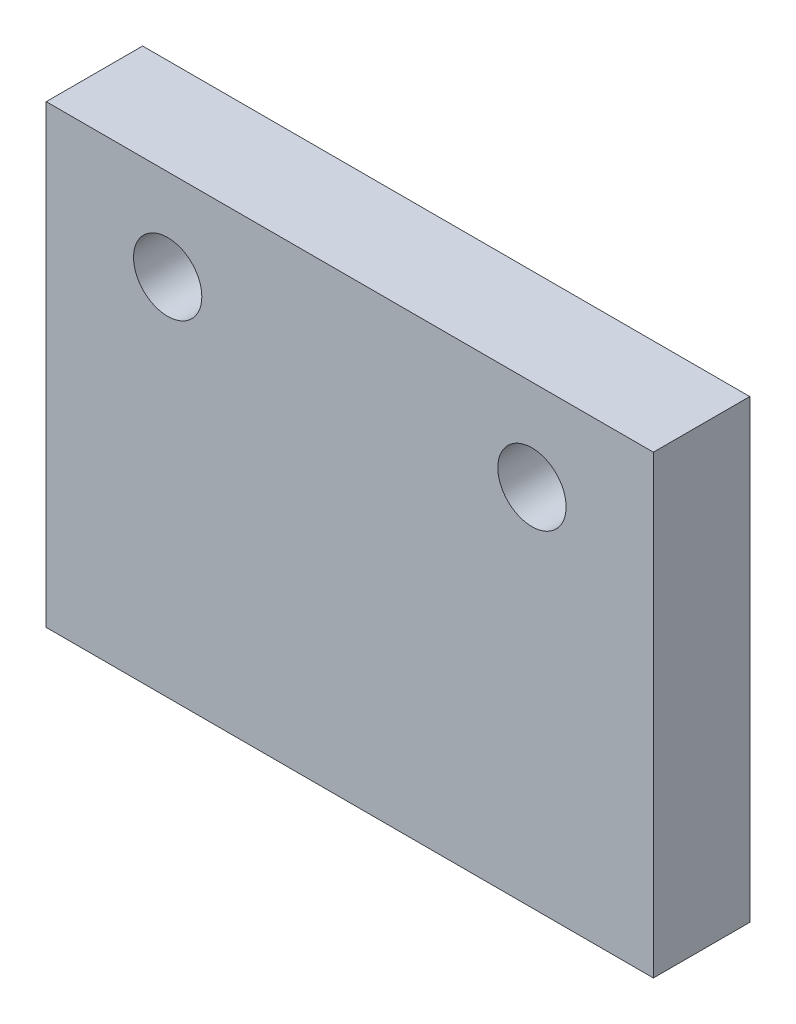
ISO-10303-21;
HEADER;
FILE_DESCRIPTION(('STEP AP214'),'2;1');
FILE_NAME('part.step','',(''),(''),'','','');
FILE_SCHEMA(('AUTOMOTIVE_DESIGN { 1 0 10303 214 1 1 1 1 }'));
ENDSEC;
DATA;
#1=APPLICATION_CONTEXT('core data for automotive mechanical design processes');
#2=APPLICATION_PROTOCOL_DEFINITION('international standard','automotive_design',2000,#1);
#3=PRODUCT_CONTEXT('',#1,'mechanical');
#4=PRODUCT('Part','Part','',(#3));
#5=PRODUCT_RELATED_PRODUCT_CATEGORY('part','',(#4));
#6=PRODUCT_DEFINITION_FORMATION('','',#4);
#7=PRODUCT_DEFINITION_CONTEXT('part definition',#1,'design');
#8=PRODUCT_DEFINITION('design','',#6,#7);
#9=PRODUCT_DEFINITION_SHAPE('','',#8);
#10=(LENGTH_UNIT() NAMED_UNIT(*) SI_UNIT(.MILLI.,.METRE.));
#11=(NAMED_UNIT(*) PLANE_ANGLE_UNIT() SI_UNIT($,.RADIAN.));
#12=(NAMED_UNIT(*) SI_UNIT($,.STERADIAN.) SOLID_ANGLE_UNIT());
#13=UNCERTAINTY_MEASURE_WITH_UNIT(LENGTH_MEASURE(1.E-05),#10,'distance_accuracy_value','');
#14=(GEOMETRIC_REPRESENTATION_CONTEXT(3) GLOBAL_UNCERTAINTY_ASSIGNED_CONTEXT((#13)) GLOBAL_UNIT_ASSIGNED_CONTEXT((#10,
#11,#12)) REPRESENTATION_CONTEXT('',''));
#15=CARTESIAN_POINT('',(0.,0.,0.));
#16=DIRECTION('',(0.,0.,1.));
#17=DIRECTION('',(1.,0.,0.));
#18=AXIS2_PLACEMENT_3D('',#15,#16,#17);
#19=CARTESIAN_POINT('',(0.,0.,6.35));
#20=DIRECTION('',(0.,0.,-1.));
#21=DIRECTION('',(-1.,0.,0.));
#22=AXIS2_PLACEMENT_3D('',#19,#20,#21);
#23=PLANE('',#22);
#24=DIRECTION('',(0.,1.,0.));
#25=VECTOR('',#24,1.);
#26=CARTESIAN_POINT('',(20.,-15.,6.35));
#27=LINE('',#26,#25);
#28=CARTESIAN_POINT('',(20.,-15.,6.35));
#29=VERTEX_POINT('',#28);
#30=CARTESIAN_POINT('',(20.,15.,6.35));
#31=VERTEX_POINT('',#30);
#32=EDGE_CURVE('E91',#29,#31,#27,.T.);
#33=ORIENTED_EDGE('',*,*,#32,.T.);
#34=DIRECTION('',(-1.,0.,0.));
#35=VECTOR('',#34,1.);
#36=CARTESIAN_POINT('',(-20.,15.,6.35));
#37=LINE('',#36,#35);
#38=CARTESIAN_POINT('',(-20.,15.,6.35));
#39=VERTEX_POINT('',#38);
#40=EDGE_CURVE('E86',#31,#39,#37,.T.);
#41=ORIENTED_EDGE('',*,*,#40,.T.);
#42=DIRECTION('',(0.,-1.,0.));
#43=VECTOR('',#42,1.);
#44=CARTESIAN_POINT('',(-20.,-15.,6.35));
#45=LINE('',#44,#43);
#46=CARTESIAN_POINT('',(-20.,-15.,6.35));
#47=VERTEX_POINT('',#46);
#48=EDGE_CURVE('E89',#39,#47,#45,.T.);
#49=ORIENTED_EDGE('',*,*,#48,.T.);
#50=DIRECTION('',(1.,0.,0.));
#51=VECTOR('',#50,1.);
#52=CARTESIAN_POINT('',(-20.,-15.,6.35));
#53=LINE('',#52,#51);
#54=EDGE_CURVE('E56',#47,#29,#53,.T.);
#55=ORIENTED_EDGE('',*,*,#54,.T.);
#56=EDGE_LOOP('',(#33,#41,#49,#55));
#57=FACE_BOUND('',#56,.T.);
#58=CARTESIAN_POINT('',(-12.,9.,6.35));
#59=DIRECTION('',(0.,0.,1.));
#60=DIRECTION('',(1.,0.,0.));
#61=AXIS2_PLACEMENT_3D('',#58,#59,#60);
#62=CIRCLE('',#61,2.25);
#63=CARTESIAN_POINT('',(-9.75,9.,6.35));
#64=VERTEX_POINT('',#63);
#65=EDGE_CURVE('E106',#64,#64,#62,.T.);
#66=ORIENTED_EDGE('',*,*,#65,.F.);
#67=EDGE_LOOP('',(#66));
#68=FACE_BOUND('',#67,.T.);
#69=CARTESIAN_POINT('',(12.,9.,6.35));
#70=DIRECTION('',(0.,0.,1.));
#71=DIRECTION('',(1.,0.,0.));
#72=AXIS2_PLACEMENT_3D('',#69,#70,#71);
#73=CIRCLE('',#72,2.25);
#74=CARTESIAN_POINT('',(14.25,9.,6.35));
#75=VERTEX_POINT('',#74);
#76=EDGE_CURVE('E121',#75,#75,#73,.T.);
#77=ORIENTED_EDGE('',*,*,#76,.F.);
#78=EDGE_LOOP('',(#77));
#79=FACE_BOUND('',#78,.T.);
#80=ADVANCED_FACE('F39',(#57,#68,#79),#23,.F.);
#81=CARTESIAN_POINT('',(0.,0.,0.));
#82=DIRECTION('',(0.,0.,-1.));
#83=DIRECTION('',(-1.,0.,0.));
#84=AXIS2_PLACEMENT_3D('',#81,#82,#83);
#85=PLANE('',#84);
#86=CARTESIAN_POINT('',(-12.,9.,0.));
#87=DIRECTION('',(0.,0.,1.));
#88=DIRECTION('',(1.,0.,0.));
#89=AXIS2_PLACEMENT_3D('',#86,#87,#88);
#90=CIRCLE('',#89,2.25);
#91=CARTESIAN_POINT('',(-9.75,9.,0.));
#92=VERTEX_POINT('',#91);
#93=EDGE_CURVE('E118',#92,#92,#90,.T.);
#94=ORIENTED_EDGE('',*,*,#93,.T.);
#95=EDGE_LOOP('',(#94));
#96=FACE_BOUND('',#95,.T.);
#97=DIRECTION('',(0.,1.,0.));
#98=VECTOR('',#97,1.);
#99=CARTESIAN_POINT('',(20.,-15.,0.));
#100=LINE('',#99,#98);
#101=CARTESIAN_POINT('',(20.,-15.,0.));
#102=VERTEX_POINT('',#101);
#103=CARTESIAN_POINT('',(20.,15.,0.));
#104=VERTEX_POINT('',#103);
#105=EDGE_CURVE('E103',#102,#104,#100,.T.);
#106=ORIENTED_EDGE('',*,*,#105,.F.);
#107=DIRECTION('',(1.,0.,0.));
#108=VECTOR('',#107,1.);
#109=CARTESIAN_POINT('',(-20.,-15.,0.));
#110=LINE('',#109,#108);
#111=CARTESIAN_POINT('',(-20.,-15.,0.));
#112=VERTEX_POINT('',#111);
#113=EDGE_CURVE('E79',#112,#102,#110,.T.);
#114=ORIENTED_EDGE('',*,*,#113,.F.);
#115=DIRECTION('',(0.,-1.,0.));
#116=VECTOR('',#115,1.);
#117=CARTESIAN_POINT('',(-20.,-15.,0.));
#118=LINE('',#117,#116);
#119=CARTESIAN_POINT('',(-20.,15.,0.));
#120=VERTEX_POINT('',#119);
#121=EDGE_CURVE('E73',#120,#112,#118,.T.);
#122=ORIENTED_EDGE('',*,*,#121,.F.);
#123=DIRECTION('',(-1.,0.,0.));
#124=VECTOR('',#123,1.);
#125=CARTESIAN_POINT('',(-20.,15.,0.));
#126=LINE('',#125,#124);
#127=EDGE_CURVE('E95',#104,#120,#126,.T.);
#128=ORIENTED_EDGE('',*,*,#127,.F.);
#129=EDGE_LOOP('',(#106,#114,#122,#128));
#130=FACE_BOUND('',#129,.T.);
#131=CARTESIAN_POINT('',(12.,9.,0.));
#132=DIRECTION('',(0.,0.,1.));
#133=DIRECTION('',(1.,0.,0.));
#134=AXIS2_PLACEMENT_3D('',#131,#132,#133);
#135=CIRCLE('',#134,2.25);
#136=CARTESIAN_POINT('',(14.25,9.,0.));
#137=VERTEX_POINT('',#136);
#138=EDGE_CURVE('E124',#137,#137,#135,.T.);
#139=ORIENTED_EDGE('',*,*,#138,.T.);
#140=EDGE_LOOP('',(#139));
#141=FACE_BOUND('',#140,.T.);
#142=ADVANCED_FACE('F114',(#96,#130,#141),#85,.T.);
#143=CARTESIAN_POINT('',(20.,-15.,6.35));
#144=DIRECTION('',(-1.,0.,0.));
#145=DIRECTION('',(0.,0.,1.));
#146=AXIS2_PLACEMENT_3D('',#143,#144,#145);
#147=PLANE('',#146);
#148=ORIENTED_EDGE('',*,*,#105,.T.);
#149=DIRECTION('',(0.,0.,-1.));
#150=VECTOR('',#149,1.);
#151=CARTESIAN_POINT('',(20.,15.,6.35));
#152=LINE('',#151,#150);
#153=EDGE_CURVE('E11',#31,#104,#152,.T.);
#154=ORIENTED_EDGE('',*,*,#153,.F.);
#155=ORIENTED_EDGE('',*,*,#32,.F.);
#156=DIRECTION('',(0.,0.,-1.));
#157=VECTOR('',#156,1.);
#158=CARTESIAN_POINT('',(20.,-15.,6.35));
#159=LINE('',#158,#157);
#160=EDGE_CURVE('E99',#29,#102,#159,.T.);
#161=ORIENTED_EDGE('',*,*,#160,.T.);
#162=EDGE_LOOP('',(#148,#154,#155,#161));
#163=FACE_BOUND('',#162,.T.);
#164=ADVANCED_FACE('F41',(#163),#147,.F.);
#165=CARTESIAN_POINT('',(-20.,15.,6.35));
#166=DIRECTION('',(0.,-1.,0.));
#167=DIRECTION('',(0.,0.,-1.));
#168=AXIS2_PLACEMENT_3D('',#165,#166,#167);
#169=PLANE('',#168);
#170=ORIENTED_EDGE('',*,*,#127,.T.);
#171=DIRECTION('',(0.,0.,-1.));
#172=VECTOR('',#171,1.);
#173=CARTESIAN_POINT('',(-20.,15.,6.35));
#174=LINE('',#173,#172);
#175=EDGE_CURVE('E48',#39,#120,#174,.T.);
#176=ORIENTED_EDGE('',*,*,#175,.F.);
#177=ORIENTED_EDGE('',*,*,#40,.F.);
#178=ORIENTED_EDGE('',*,*,#153,.T.);
#179=EDGE_LOOP('',(#170,#176,#177,#178));
#180=FACE_BOUND('',#179,.T.);
#181=ADVANCED_FACE('F94',(#180),#169,.F.);
#182=CARTESIAN_POINT('',(-20.,-15.,6.35));
#183=DIRECTION('',(1.,0.,0.));
#184=DIRECTION('',(0.,0.,-1.));
#185=AXIS2_PLACEMENT_3D('',#182,#183,#184);
#186=PLANE('',#185);
#187=ORIENTED_EDGE('',*,*,#121,.T.);
#188=DIRECTION('',(0.,0.,-1.));
#189=VECTOR('',#188,1.);
#190=CARTESIAN_POINT('',(-20.,-15.,6.35));
#191=LINE('',#190,#189);
#192=EDGE_CURVE('E96',#47,#112,#191,.T.);
#193=ORIENTED_EDGE('',*,*,#192,.F.);
#194=ORIENTED_EDGE('',*,*,#48,.F.);
#195=ORIENTED_EDGE('',*,*,#175,.T.);
#196=EDGE_LOOP('',(#187,#193,#194,#195));
#197=FACE_BOUND('',#196,.T.);
#198=ADVANCED_FACE('F97',(#197),#186,.F.);
#199=CARTESIAN_POINT('',(-20.,-15.,6.35));
#200=DIRECTION('',(0.,1.,0.));
#201=DIRECTION('',(0.,0.,1.));
#202=AXIS2_PLACEMENT_3D('',#199,#200,#201);
#203=PLANE('',#202);
#204=ORIENTED_EDGE('',*,*,#113,.T.);
#205=ORIENTED_EDGE('',*,*,#160,.F.);
#206=ORIENTED_EDGE('',*,*,#54,.F.);
#207=ORIENTED_EDGE('',*,*,#192,.T.);
#208=EDGE_LOOP('',(#204,#205,#206,#207));
#209=FACE_BOUND('',#208,.T.);
#210=ADVANCED_FACE('F111',(#209),#203,.F.);
#211=CARTESIAN_POINT('',(-12.,9.,6.35));
#212=DIRECTION('',(0.,0.,-1.));
#213=DIRECTION('',(-1.,0.,0.));
#214=AXIS2_PLACEMENT_3D('',#211,#212,#213);
#215=CYLINDRICAL_SURFACE('',#214,2.25);
#216=ORIENTED_EDGE('',*,*,#65,.T.);
#217=EDGE_LOOP('',(#216));
#218=FACE_BOUND('',#217,.T.);
#219=ORIENTED_EDGE('',*,*,#93,.F.);
#220=EDGE_LOOP('',(#219));
#221=FACE_BOUND('',#220,.T.);
#222=ADVANCED_FACE('F141',(#218,#221),#215,.F.);
#223=CARTESIAN_POINT('',(12.,9.,6.35));
#224=DIRECTION('',(0.,0.,-1.));
#225=DIRECTION('',(-1.,0.,0.));
#226=AXIS2_PLACEMENT_3D('',#223,#224,#225);
#227=CYLINDRICAL_SURFACE('',#226,2.25);
#228=ORIENTED_EDGE('',*,*,#76,.T.);
#229=EDGE_LOOP('',(#228));
#230=FACE_BOUND('',#229,.T.);
#231=ORIENTED_EDGE('',*,*,#138,.F.);
#232=EDGE_LOOP('',(#231));
#233=FACE_BOUND('',#232,.T.);
#234=ADVANCED_FACE('F130',(#230,#233),#227,.F.);
#235=CLOSED_SHELL('',(#80,#142,#164,#181,#198,#210,#222,#234));
#236=MANIFOLD_SOLID_BREP('B2',#235);
#237=ADVANCED_BREP_SHAPE_REPRESENTATION('',(#18,#236),#14);
#238=SHAPE_DEFINITION_REPRESENTATION(#9,#237);
ENDSEC;
END-ISO-10303-21;
